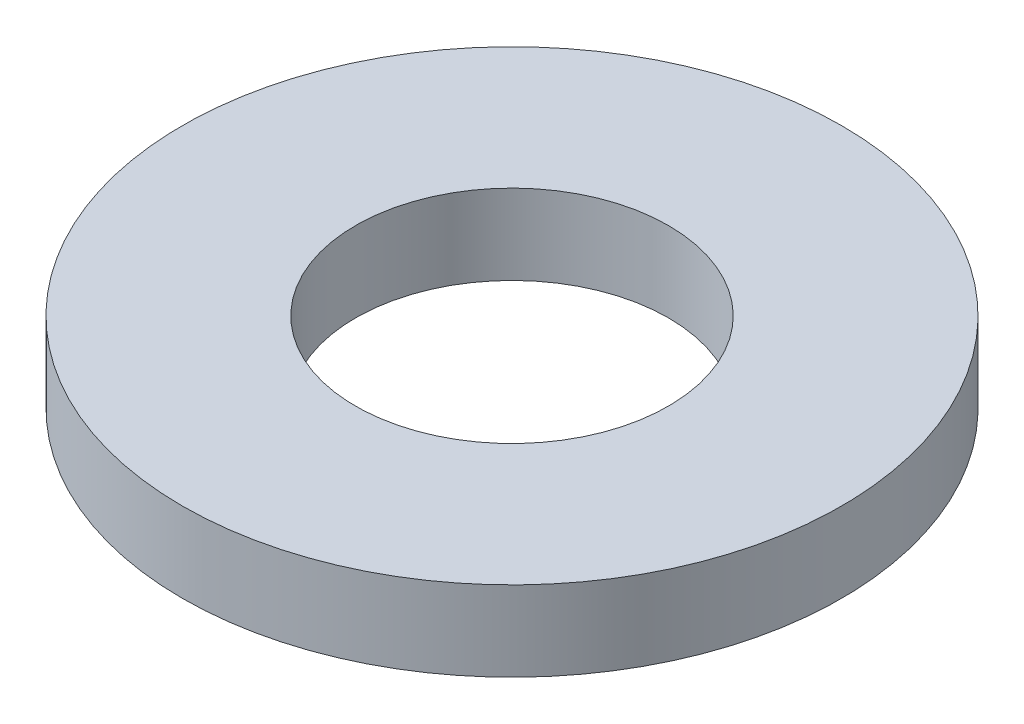
ISO-10303-21;
HEADER;
FILE_DESCRIPTION(('STEP AP214'),'2;1');
FILE_NAME('part.step','',(''),(''),'','','');
FILE_SCHEMA(('AUTOMOTIVE_DESIGN { 1 0 10303 214 1 1 1 1 }'));
ENDSEC;
DATA;
#1=APPLICATION_CONTEXT('core data for automotive mechanical design processes');
#2=APPLICATION_PROTOCOL_DEFINITION('international standard','automotive_design',2000,#1);
#3=PRODUCT_CONTEXT('',#1,'mechanical');
#4=PRODUCT('Part','Part','',(#3));
#5=PRODUCT_RELATED_PRODUCT_CATEGORY('part','',(#4));
#6=PRODUCT_DEFINITION_FORMATION('','',#4);
#7=PRODUCT_DEFINITION_CONTEXT('part definition',#1,'design');
#8=PRODUCT_DEFINITION('design','',#6,#7);
#9=PRODUCT_DEFINITION_SHAPE('','',#8);
#10=(LENGTH_UNIT() NAMED_UNIT(*) SI_UNIT(.MILLI.,.METRE.));
#11=(NAMED_UNIT(*) PLANE_ANGLE_UNIT() SI_UNIT($,.RADIAN.));
#12=(NAMED_UNIT(*) SI_UNIT($,.STERADIAN.) SOLID_ANGLE_UNIT());
#13=UNCERTAINTY_MEASURE_WITH_UNIT(LENGTH_MEASURE(1.E-05),#10,'distance_accuracy_value','');
#14=(GEOMETRIC_REPRESENTATION_CONTEXT(3) GLOBAL_UNCERTAINTY_ASSIGNED_CONTEXT((#13)) GLOBAL_UNIT_ASSIGNED_CONTEXT((#10,
#11,#12)) REPRESENTATION_CONTEXT('',''));
#15=CARTESIAN_POINT('',(0.,0.,0.));
#16=DIRECTION('',(0.,0.,1.));
#17=DIRECTION('',(1.,0.,0.));
#18=AXIS2_PLACEMENT_3D('',#15,#16,#17);
#19=CARTESIAN_POINT('',(0.,3.,0.));
#20=DIRECTION('',(0.,-1.,0.));
#21=DIRECTION('',(0.,0.,-1.));
#22=AXIS2_PLACEMENT_3D('',#19,#20,#21);
#23=CYLINDRICAL_SURFACE('',#22,12.36);
#24=CARTESIAN_POINT('',(0.,3.,0.));
#25=DIRECTION('',(0.,1.,0.));
#26=DIRECTION('',(0.,0.,1.));
#27=AXIS2_PLACEMENT_3D('',#24,#25,#26);
#28=CIRCLE('',#27,12.36);
#29=CARTESIAN_POINT('',(0.,3.,12.36));
#30=VERTEX_POINT('',#29);
#31=EDGE_CURVE('E10',#30,#30,#28,.T.);
#32=ORIENTED_EDGE('',*,*,#31,.F.);
#33=EDGE_LOOP('',(#32));
#34=FACE_BOUND('',#33,.T.);
#35=CARTESIAN_POINT('',(0.,0.,0.));
#36=DIRECTION('',(0.,1.,0.));
#37=DIRECTION('',(0.,0.,1.));
#38=AXIS2_PLACEMENT_3D('',#35,#36,#37);
#39=CIRCLE('',#38,12.36);
#40=CARTESIAN_POINT('',(0.,0.,12.36));
#41=VERTEX_POINT('',#40);
#42=EDGE_CURVE('E46',#41,#41,#39,.T.);
#43=ORIENTED_EDGE('',*,*,#42,.T.);
#44=EDGE_LOOP('',(#43));
#45=FACE_BOUND('',#44,.T.);
#46=ADVANCED_FACE('F43',(#34,#45),#23,.T.);
#47=CARTESIAN_POINT('',(0.,3.,0.));
#48=DIRECTION('',(0.,1.,0.));
#49=DIRECTION('',(0.,0.,1.));
#50=AXIS2_PLACEMENT_3D('',#47,#48,#49);
#51=PLANE('',#50);
#52=CARTESIAN_POINT('',(0.,3.,0.));
#53=DIRECTION('',(0.,-1.,0.));
#54=DIRECTION('',(0.,0.,-1.));
#55=AXIS2_PLACEMENT_3D('',#52,#53,#54);
#56=CIRCLE('',#55,5.8674);
#57=CARTESIAN_POINT('',(0.,3.,-5.8674));
#58=VERTEX_POINT('',#57);
#59=EDGE_CURVE('E55',#58,#58,#56,.T.);
#60=ORIENTED_EDGE('',*,*,#59,.T.);
#61=EDGE_LOOP('',(#60));
#62=FACE_BOUND('',#61,.T.);
#63=ORIENTED_EDGE('',*,*,#31,.T.);
#64=EDGE_LOOP('',(#63));
#65=FACE_BOUND('',#64,.T.);
#66=ADVANCED_FACE('F65',(#62,#65),#51,.T.);
#67=CARTESIAN_POINT('',(0.,0.,0.));
#68=DIRECTION('',(0.,1.,0.));
#69=DIRECTION('',(0.,0.,1.));
#70=AXIS2_PLACEMENT_3D('',#67,#68,#69);
#71=PLANE('',#70);
#72=CARTESIAN_POINT('',(0.,0.,0.));
#73=DIRECTION('',(0.,-1.,0.));
#74=DIRECTION('',(0.,0.,-1.));
#75=AXIS2_PLACEMENT_3D('',#72,#73,#74);
#76=CIRCLE('',#75,5.8674);
#77=CARTESIAN_POINT('',(0.,0.,-5.8674));
#78=VERTEX_POINT('',#77);
#79=EDGE_CURVE('E57',#78,#78,#76,.T.);
#80=ORIENTED_EDGE('',*,*,#79,.F.);
#81=EDGE_LOOP('',(#80));
#82=FACE_BOUND('',#81,.T.);
#83=ORIENTED_EDGE('',*,*,#42,.F.);
#84=EDGE_LOOP('',(#83));
#85=FACE_BOUND('',#84,.T.);
#86=ADVANCED_FACE('F70',(#82,#85),#71,.F.);
#87=CARTESIAN_POINT('',(0.,3.,0.));
#88=DIRECTION('',(0.,-1.,0.));
#89=DIRECTION('',(0.,0.,-1.));
#90=AXIS2_PLACEMENT_3D('',#87,#88,#89);
#91=CYLINDRICAL_SURFACE('',#90,5.8674);
#92=ORIENTED_EDGE('',*,*,#59,.F.);
#93=EDGE_LOOP('',(#92));
#94=FACE_BOUND('',#93,.T.);
#95=ORIENTED_EDGE('',*,*,#79,.T.);
#96=EDGE_LOOP('',(#95));
#97=FACE_BOUND('',#96,.T.);
#98=ADVANCED_FACE('F67',(#94,#97),#91,.F.);
#99=CLOSED_SHELL('',(#46,#66,#86,#98));
#100=MANIFOLD_SOLID_BREP('B2',#99);
#101=ADVANCED_BREP_SHAPE_REPRESENTATION('',(#18,#100),#14);
#102=SHAPE_DEFINITION_REPRESENTATION(#9,#101);
ENDSEC;
END-ISO-10303-21;
